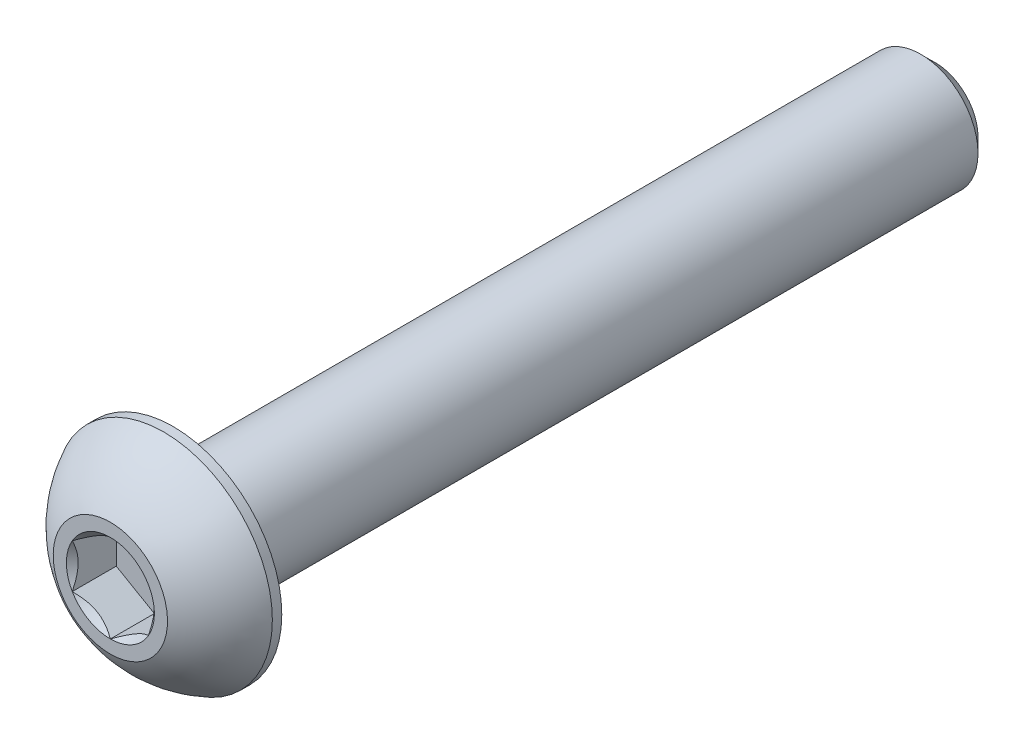
ISO-10303-21;
HEADER;
FILE_DESCRIPTION(('STEP AP214'),'2;1');
FILE_NAME('part.step','',(''),(''),'','','');
FILE_SCHEMA(('AUTOMOTIVE_DESIGN { 1 0 10303 214 1 1 1 1 }'));
ENDSEC;
DATA;
#1=APPLICATION_CONTEXT('core data for automotive mechanical design processes');
#2=APPLICATION_PROTOCOL_DEFINITION('international standard','automotive_design',2000,#1);
#3=PRODUCT_CONTEXT('',#1,'mechanical');
#4=PRODUCT('Part','Part','',(#3));
#5=PRODUCT_RELATED_PRODUCT_CATEGORY('part','',(#4));
#6=PRODUCT_DEFINITION_FORMATION('','',#4);
#7=PRODUCT_DEFINITION_CONTEXT('part definition',#1,'design');
#8=PRODUCT_DEFINITION('design','',#6,#7);
#9=PRODUCT_DEFINITION_SHAPE('','',#8);
#10=(LENGTH_UNIT() NAMED_UNIT(*) SI_UNIT(.MILLI.,.METRE.));
#11=(NAMED_UNIT(*) PLANE_ANGLE_UNIT() SI_UNIT($,.RADIAN.));
#12=(NAMED_UNIT(*) SI_UNIT($,.STERADIAN.) SOLID_ANGLE_UNIT());
#13=UNCERTAINTY_MEASURE_WITH_UNIT(LENGTH_MEASURE(1.E-05),#10,'distance_accuracy_value','');
#14=(GEOMETRIC_REPRESENTATION_CONTEXT(3) GLOBAL_UNCERTAINTY_ASSIGNED_CONTEXT((#13)) GLOBAL_UNIT_ASSIGNED_CONTEXT((#10,
#11,#12)) REPRESENTATION_CONTEXT('',''));
#15=CARTESIAN_POINT('',(0.,0.,0.));
#16=DIRECTION('',(0.,0.,1.));
#17=DIRECTION('',(1.,0.,0.));
#18=AXIS2_PLACEMENT_3D('',#15,#16,#17);
#19=CARTESIAN_POINT('',(0.,-1.5,-21.65));
#20=DIRECTION('',(0.,0.,-1.));
#21=DIRECTION('',(0.,1.,0.));
#22=AXIS2_PLACEMENT_3D('',#19,#20,#21);
#23=PLANE('',#22);
#24=CARTESIAN_POINT('',(0.,0.,-21.65));
#25=DIRECTION('',(0.,0.,-1.));
#26=DIRECTION('',(0.,1.,0.));
#27=AXIS2_PLACEMENT_3D('',#24,#25,#26);
#28=CIRCLE('',#27,1.125);
#29=CARTESIAN_POINT('',(0.,-1.125,-21.65));
#30=VERTEX_POINT('',#29);
#31=EDGE_CURVE('E175',#30,#30,#28,.T.);
#32=ORIENTED_EDGE('',*,*,#31,.T.);
#33=EDGE_LOOP('',(#32));
#34=FACE_BOUND('',#33,.T.);
#35=ADVANCED_FACE('F35',(#34),#23,.T.);
#36=CARTESIAN_POINT('',(0.,0.,-21.65));
#37=DIRECTION('',(0.,0.,-1.));
#38=DIRECTION('',(0.,1.,0.));
#39=AXIS2_PLACEMENT_3D('',#36,#37,#38);
#40=CYLINDRICAL_SURFACE('',#39,1.5);
#41=CARTESIAN_POINT('',(0.,0.,-21.275));
#42=DIRECTION('',(0.,0.,-1.));
#43=DIRECTION('',(0.,1.,0.));
#44=AXIS2_PLACEMENT_3D('',#41,#42,#43);
#45=CIRCLE('',#44,1.5);
#46=CARTESIAN_POINT('',(0.,-1.5,-21.275));
#47=VERTEX_POINT('',#46);
#48=EDGE_CURVE('E49',#47,#47,#45,.F.);
#49=ORIENTED_EDGE('',*,*,#48,.T.);
#50=EDGE_LOOP('',(#49));
#51=FACE_BOUND('',#50,.T.);
#52=CARTESIAN_POINT('',(0.,0.,-1.65));
#53=DIRECTION('',(0.,0.,1.));
#54=DIRECTION('',(1.,0.,0.));
#55=AXIS2_PLACEMENT_3D('',#52,#53,#54);
#56=CIRCLE('',#55,1.5);
#57=CARTESIAN_POINT('',(1.5,0.,-1.65));
#58=VERTEX_POINT('',#57);
#59=EDGE_CURVE('E172',#58,#58,#56,.F.);
#60=ORIENTED_EDGE('',*,*,#59,.T.);
#61=EDGE_LOOP('',(#60));
#62=FACE_BOUND('',#61,.T.);
#63=ADVANCED_FACE('F180',(#51,#62),#40,.T.);
#64=CARTESIAN_POINT('',(0.,0.,-21.65));
#65=DIRECTION('',(0.,0.,1.));
#66=DIRECTION('',(0.,-1.,0.));
#67=AXIS2_PLACEMENT_3D('',#64,#65,#66);
#68=CONICAL_SURFACE('',#67,1.125,0.785398163397446);
#69=CARTESIAN_POINT('',(0.,-1.5,-21.275));
#70=CARTESIAN_POINT('',(0.,-1.49609375,-21.27890625));
#71=CARTESIAN_POINT('',(0.,-1.4921875,-21.2828125));
#72=CARTESIAN_POINT('',(0.,-1.484375,-21.290625));
#73=CARTESIAN_POINT('',(0.,-1.48046875,-21.29453125));
#74=CARTESIAN_POINT('',(0.,-1.47265625,-21.30234375));
#75=CARTESIAN_POINT('',(0.,-1.46875,-21.30625));
#76=CARTESIAN_POINT('',(0.,-1.4609375,-21.3140625));
#77=CARTESIAN_POINT('',(0.,-1.45703125,-21.31796875));
#78=CARTESIAN_POINT('',(0.,-1.44921875,-21.32578125));
#79=CARTESIAN_POINT('',(0.,-1.4453125,-21.3296875));
#80=CARTESIAN_POINT('',(0.,-1.4375,-21.3375));
#81=CARTESIAN_POINT('',(0.,-1.43359375,-21.34140625));
#82=CARTESIAN_POINT('',(0.,-1.42578125,-21.34921875));
#83=CARTESIAN_POINT('',(0.,-1.421875,-21.353125));
#84=CARTESIAN_POINT('',(0.,-1.4140625,-21.3609375));
#85=CARTESIAN_POINT('',(0.,-1.41015625,-21.36484375));
#86=CARTESIAN_POINT('',(0.,-1.40234375,-21.37265625));
#87=CARTESIAN_POINT('',(0.,-1.3984375,-21.3765625));
#88=CARTESIAN_POINT('',(0.,-1.390625,-21.384375));
#89=CARTESIAN_POINT('',(0.,-1.38671875,-21.38828125));
#90=CARTESIAN_POINT('',(0.,-1.37890625,-21.39609375));
#91=CARTESIAN_POINT('',(0.,-1.375,-21.4));
#92=CARTESIAN_POINT('',(0.,-1.3671875,-21.4078125));
#93=CARTESIAN_POINT('',(0.,-1.36328125,-21.41171875));
#94=CARTESIAN_POINT('',(0.,-1.35546875,-21.41953125));
#95=CARTESIAN_POINT('',(0.,-1.3515625,-21.4234375));
#96=CARTESIAN_POINT('',(0.,-1.34375,-21.43125));
#97=CARTESIAN_POINT('',(0.,-1.33984375,-21.43515625));
#98=CARTESIAN_POINT('',(0.,-1.33203125,-21.44296875));
#99=CARTESIAN_POINT('',(0.,-1.328125,-21.446875));
#100=CARTESIAN_POINT('',(0.,-1.3203125,-21.4546875));
#101=CARTESIAN_POINT('',(0.,-1.31640625,-21.45859375));
#102=CARTESIAN_POINT('',(0.,-1.30859375,-21.46640625));
#103=CARTESIAN_POINT('',(0.,-1.3046875,-21.4703125));
#104=CARTESIAN_POINT('',(0.,-1.296875,-21.478125));
#105=CARTESIAN_POINT('',(0.,-1.29296875,-21.48203125));
#106=CARTESIAN_POINT('',(0.,-1.28515625,-21.48984375));
#107=CARTESIAN_POINT('',(0.,-1.28125,-21.49375));
#108=CARTESIAN_POINT('',(0.,-1.2734375,-21.5015625));
#109=CARTESIAN_POINT('',(0.,-1.26953125,-21.50546875));
#110=CARTESIAN_POINT('',(0.,-1.26171875,-21.51328125));
#111=CARTESIAN_POINT('',(0.,-1.2578125,-21.5171875));
#112=CARTESIAN_POINT('',(0.,-1.25,-21.525));
#113=CARTESIAN_POINT('',(0.,-1.24609375,-21.52890625));
#114=CARTESIAN_POINT('',(0.,-1.23828125,-21.53671875));
#115=CARTESIAN_POINT('',(0.,-1.234375,-21.540625));
#116=CARTESIAN_POINT('',(0.,-1.2265625,-21.5484375));
#117=CARTESIAN_POINT('',(0.,-1.22265625,-21.55234375));
#118=CARTESIAN_POINT('',(0.,-1.21484375,-21.56015625));
#119=CARTESIAN_POINT('',(0.,-1.2109375,-21.5640625));
#120=CARTESIAN_POINT('',(0.,-1.203125,-21.571875));
#121=CARTESIAN_POINT('',(0.,-1.19921875,-21.57578125));
#122=CARTESIAN_POINT('',(0.,-1.19140625,-21.58359375));
#123=CARTESIAN_POINT('',(0.,-1.1875,-21.5875));
#124=CARTESIAN_POINT('',(0.,-1.1796875,-21.5953125));
#125=CARTESIAN_POINT('',(0.,-1.17578125,-21.59921875));
#126=CARTESIAN_POINT('',(0.,-1.16796875,-21.60703125));
#127=CARTESIAN_POINT('',(0.,-1.1640625,-21.6109375));
#128=CARTESIAN_POINT('',(0.,-1.15625,-21.61875));
#129=CARTESIAN_POINT('',(0.,-1.15234375,-21.62265625));
#130=CARTESIAN_POINT('',(0.,-1.14453125,-21.63046875));
#131=CARTESIAN_POINT('',(0.,-1.140625,-21.634375));
#132=CARTESIAN_POINT('',(0.,-1.1328125,-21.6421875));
#133=CARTESIAN_POINT('',(0.,-1.12890625,-21.64609375));
#134=CARTESIAN_POINT('',(0.,-1.125,-21.65));
#135=B_SPLINE_CURVE_WITH_KNOTS('',3,(#69,#70,#71,#72,#73,#74,#75,#76,#77,#78,#79,#80,#81,#82,
#83,#84,#85,#86,#87,#88,#89,#90,#91,#92,#93,#94,#95,#96,#97,#98,#99,#100,#101,#102,#103,#104,
#105,#106,#107,#108,#109,#110,#111,#112,#113,#114,#115,#116,#117,#118,#119,#120,#121,#122,#123,
#124,#125,#126,#127,#128,#129,#130,#131,#132,#133,#134),.UNSPECIFIED.,.F.,.F.,(4,2,2,2,2,2,2,2,
2,2,2,2,2,2,2,2,2,2,2,2,2,2,2,2,2,2,2,2,2,2,2,2,4),(0.,0.0165728151840599,0.0331456303681198,
0.0497184455521798,0.0662912607362397,0.0828640759202995,0.0994368911043594,0.116009706288417,
0.132582521472477,0.149155336656537,0.165728151840597,0.182300967024657,0.198873782208716,
0.215446597392774,0.232019412576834,0.248592227760894,0.265165042944954,0.281737858129014,
0.298310673313074,0.314883488497133,0.331456303681191,0.348029118865251,0.364601934049311,
0.381174749233371,0.397747564417431,0.414320379601491,0.430893194785548,0.447466009969608,
0.464038825153668,0.480611640337728,0.497184455521788,0.513757270705848,0.530330085889905),.UNSPECIFIED.);
#136=EDGE_CURVE('BSEAM37',#47,#30,#135,.T.);
#137=ORIENTED_EDGE('',*,*,#48,.F.);
#138=ORIENTED_EDGE('',*,*,#31,.F.);
#139=ORIENTED_EDGE('',*,*,#136,.T.);
#140=ORIENTED_EDGE('',*,*,#136,.F.);
#141=EDGE_LOOP('',(#137,#139,#138,#140));
#142=FACE_BOUND('',#141,.T.);
#143=ADVANCED_FACE('F37',(#142),#68,.T.);
#144=CARTESIAN_POINT('',(0.,0.,-2.79483288770053));
#145=DIRECTION('',(0.,0.,1.));
#146=DIRECTION('',(0.,-1.,0.));
#147=AXIS2_PLACEMENT_3D('',#144,#145,#146);
#148=SPHERICAL_SURFACE('',#147,3.17192226735973);
#149=CARTESIAN_POINT('',(0.,0.,0.));
#150=DIRECTION('',(0.,0.,1.));
#151=DIRECTION('',(1.,0.,0.));
#152=AXIS2_PLACEMENT_3D('',#149,#150,#151);
#153=CIRCLE('',#152,1.5);
#154=CARTESIAN_POINT('',(0.,-1.5,0.));
#155=VERTEX_POINT('',#154);
#156=EDGE_CURVE('E169',#155,#155,#153,.T.);
#157=CARTESIAN_POINT('',(0.,0.,-1.4025));
#158=DIRECTION('',(0.,0.,1.));
#159=DIRECTION('',(1.,0.,0.));
#160=AXIS2_PLACEMENT_3D('',#157,#158,#159);
#161=CIRCLE('',#160,2.85);
#162=CARTESIAN_POINT('',(0.,-2.85,-1.4025));
#163=VERTEX_POINT('',#162);
#164=EDGE_CURVE('E163',#163,#163,#161,.T.);
#165=CARTESIAN_POINT('',(0.,-1.5,0.));
#166=CARTESIAN_POINT('',(0.,-1.5181600798921,-0.00974656947336525));
#167=CARTESIAN_POINT('',(0.,-1.53622513742981,-0.0196701847238475));
#168=CARTESIAN_POINT('',(0.,-1.57215840256594,-0.0398676311293121));
#169=CARTESIAN_POINT('',(0.,-1.59002661016438,-0.0501414622842944));
#170=CARTESIAN_POINT('',(0.,-1.6255593701915,-0.0710354648490241));
#171=CARTESIAN_POINT('',(0.,-1.64322392262019,-0.0816556362587714));
#172=CARTESIAN_POINT('',(0.,-1.67834266450262,-0.103238276426967));
#173=CARTESIAN_POINT('',(0.,-1.69579685395636,-0.114200745185416));
#174=CARTESIAN_POINT('',(0.,-1.73048823664554,-0.136463816635606));
#175=CARTESIAN_POINT('',(0.,-1.74772542988099,-0.147764419327347));
#176=CARTESIAN_POINT('',(0.,-1.78197627078176,-0.170699464187153));
#177=CARTESIAN_POINT('',(0.,-1.79898991844709,-0.182333906355219));
#178=CARTESIAN_POINT('',(0.,-1.83278720341135,-0.205932209546912));
#179=CARTESIAN_POINT('',(0.,-1.84957084071028,-0.21789607057054));
#180=CARTESIAN_POINT('',(0.,-1.88290172764636,-0.242148665498754));
#181=CARTESIAN_POINT('',(0.,-1.8994489772835,-0.254437399403341));
#182=CARTESIAN_POINT('',(0.,-1.93230080139369,-0.279335070725423));
#183=CARTESIAN_POINT('',(0.,-1.94860537586673,-0.291944008142919));
#184=CARTESIAN_POINT('',(0.,-1.98096565436365,-0.317477295441111));
#185=CARTESIAN_POINT('',(0.,-1.99702135838753,-0.330401645321806));
#186=CARTESIAN_POINT('',(0.,-2.02887779526296,-0.356560846652225));
#187=CARTESIAN_POINT('',(0.,-2.04467852811452,-0.369795698101948));
#188=CARTESIAN_POINT('',(0.,-2.07601901880464,-0.396570873693307));
#189=CARTESIAN_POINT('',(0.,-2.09155877664321,-0.410111197834943));
#190=CARTESIAN_POINT('',(0.,-2.12237141262985,-0.437492173862105));
#191=CARTESIAN_POINT('',(0.,-2.13764429077792,-0.451332825747633));
#192=CARTESIAN_POINT('',(0.,-2.16791736411296,-0.479309198198267));
#193=CARTESIAN_POINT('',(0.,-2.18291755929993,-0.493444918763374));
#194=CARTESIAN_POINT('',(0.,-2.21263956705415,-0.52200605739095));
#195=CARTESIAN_POINT('',(0.,-2.22736137962139,-0.536431475453418));
#196=CARTESIAN_POINT('',(0.,-2.2565210282552,-0.56556652781647));
#197=CARTESIAN_POINT('',(0.,-2.27095886432177,-0.580276162117054));
#198=CARTESIAN_POINT('',(0.,-2.2995450739765,-0.609974057702794));
#199=CARTESIAN_POINT('',(0.,-2.31369344756465,-0.624962318987951));
#200=CARTESIAN_POINT('',(0.,-2.34169535627252,-0.655211773418758));
#201=CARTESIAN_POINT('',(0.,-2.35554889139223,-0.670472966564409));
#202=CARTESIAN_POINT('',(0.,-2.38295585920366,-0.701262485885582));
#203=CARTESIAN_POINT('',(0.,-2.39650929189537,-0.716790812061104));
#204=CARTESIAN_POINT('',(0.,-2.42331090492182,-0.748108697108241));
#205=CARTESIAN_POINT('',(0.,-2.43655908525656,-0.763898255979857));
#206=CARTESIAN_POINT('',(0.,-2.46274515962755,-0.795732606824226));
#207=CARTESIAN_POINT('',(0.,-2.47568305366379,-0.811777398796979));
#208=CARTESIAN_POINT('',(0.,-2.50124363939651,-0.844116119267125));
#209=CARTESIAN_POINT('',(0.,-2.51386633109298,-0.860410047764518));
#210=CARTESIAN_POINT('',(0.,-2.53879171587278,-0.893240850042598));
#211=CARTESIAN_POINT('',(0.,-2.55109440895612,-0.909777723823285));
#212=CARTESIAN_POINT('',(0.,-2.57537512182785,-0.943088133113638));
#213=CARTESIAN_POINT('',(0.,-2.58735314161625,-0.959861668623304));
#214=CARTESIAN_POINT('',(0.,-2.61097995657956,-0.993639027894246));
#215=CARTESIAN_POINT('',(0.,-2.62262875175448,-1.01064285165552));
#216=CARTESIAN_POINT('',(0.,-2.64559269128199,-1.04487432644225));
#217=CARTESIAN_POINT('',(0.,-2.65690783563458,-1.06210197746771));
#218=CARTESIAN_POINT('',(0.,-2.67920017403639,-1.09677456077299));
#219=CARTESIAN_POINT('',(0.,-2.69017736808561,-1.11421949305282));
#220=CARTESIAN_POINT('',(0.,-2.711789634999,-1.14932001019995));
#221=CARTESIAN_POINT('',(0.,-2.72242470786316,-1.16697559506725));
#222=CARTESIAN_POINT('',(0.,-2.74334869082118,-1.20249070903943));
#223=CARTESIAN_POINT('',(0.,-2.75363760091502,-1.22035023814429));
#224=CARTESIAN_POINT('',(0.,-2.77386535089241,-1.25626645340824));
#225=CARTESIAN_POINT('',(0.,-2.78380419077596,-1.27432313956732));
#226=CARTESIAN_POINT('',(0.,-2.80332801615778,-1.31062681184411));
#227=CARTESIAN_POINT('',(0.,-2.81291300165605,-1.32887379796182));
#228=CARTESIAN_POINT('',(0.,-2.83172550494215,-1.3655511220839));
#229=CARTESIAN_POINT('',(0.,-2.84095302272998,-1.38398146008827));
#230=CARTESIAN_POINT('',(0.,-2.85,-1.4025));
#231=B_SPLINE_CURVE_WITH_KNOTS('',3,(#165,#166,#167,#168,#169,#170,#171,#172,#173,#174,#175,
#176,#177,#178,#179,#180,#181,#182,#183,#184,#185,#186,#187,#188,#189,#190,#191,#192,#193,#194,
#195,#196,#197,#198,#199,#200,#201,#202,#203,#204,#205,#206,#207,#208,#209,#210,#211,#212,#213,
#214,#215,#216,#217,#218,#219,#220,#221,#222,#223,#224,#225,#226,#227,#228,#229,#230),
.UNSPECIFIED.,.F.,.F.,(4,2,2,2,2,2,2,2,2,2,2,2,2,2,2,2,2,2,2,2,2,2,2,2,2,2,2,2,2,2,2,2,4),(0.,
0.0618298941826981,0.123659788365397,0.185489682548095,0.247319576730793,0.309149470913491,
0.37097936509619,0.432809259278888,0.494639153461585,0.556469047644284,0.618298941826982,
0.680128836009681,0.741958730192379,0.803788624375077,0.865618518557775,0.927448412740473,
0.989278306923172,1.05110820110587,1.11293809528857,1.17476798947127,1.23659788365396,
1.29842777783666,1.36025767201936,1.42208756620206,1.48391746038476,1.54574735456746,
1.60757724875015,1.66940714293285,1.73123703711555,1.79306693129825,1.85489682548095,
1.91672671966364,1.97855661384634),.UNSPECIFIED.);
#232=EDGE_CURVE('BSEAM185',#155,#163,#231,.T.);
#233=ORIENTED_EDGE('',*,*,#156,.F.);
#234=ORIENTED_EDGE('',*,*,#164,.T.);
#235=ORIENTED_EDGE('',*,*,#232,.T.);
#236=ORIENTED_EDGE('',*,*,#232,.F.);
#237=EDGE_LOOP('',(#233,#235,#234,#236));
#238=FACE_BOUND('',#237,.T.);
#239=ADVANCED_FACE('F185',(#238),#148,.T.);
#240=CARTESIAN_POINT('',(0.,-1.5,0.));
#241=DIRECTION('',(0.,0.,-1.));
#242=DIRECTION('',(-1.,0.,0.));
#243=AXIS2_PLACEMENT_3D('',#240,#241,#242);
#244=PLANE('',#243);
#245=CARTESIAN_POINT('',(0.,0.,0.));
#246=DIRECTION('',(0.,0.,1.));
#247=DIRECTION('',(1.,0.,0.));
#248=AXIS2_PLACEMENT_3D('',#245,#246,#247);
#249=CIRCLE('',#248,1.15470053837925);
#250=CARTESIAN_POINT('',(-1.,0.577350269189626,0.));
#251=VERTEX_POINT('',#250);
#252=CARTESIAN_POINT('',(-1.,-0.577350269189626,0.));
#253=VERTEX_POINT('',#252);
#254=EDGE_CURVE('E62',#251,#253,#249,.T.);
#255=ORIENTED_EDGE('',*,*,#254,.F.);
#256=CARTESIAN_POINT('',(0.,1.15470053837925,0.));
#257=VERTEX_POINT('',#256);
#258=EDGE_CURVE('E134',#257,#251,#249,.T.);
#259=ORIENTED_EDGE('',*,*,#258,.F.);
#260=CARTESIAN_POINT('',(1.,0.577350269189626,0.));
#261=VERTEX_POINT('',#260);
#262=EDGE_CURVE('E131',#261,#257,#249,.T.);
#263=ORIENTED_EDGE('',*,*,#262,.F.);
#264=CARTESIAN_POINT('',(1.,-0.577350269189626,0.));
#265=VERTEX_POINT('',#264);
#266=EDGE_CURVE('E102',#265,#261,#249,.T.);
#267=ORIENTED_EDGE('',*,*,#266,.F.);
#268=CARTESIAN_POINT('',(0.,-1.15470053837925,0.));
#269=VERTEX_POINT('',#268);
#270=EDGE_CURVE('E94',#269,#265,#249,.T.);
#271=ORIENTED_EDGE('',*,*,#270,.F.);
#272=EDGE_CURVE('E55',#253,#269,#249,.T.);
#273=ORIENTED_EDGE('',*,*,#272,.F.);
#274=EDGE_LOOP('',(#255,#259,#263,#267,#271,#273));
#275=FACE_BOUND('',#274,.T.);
#276=ORIENTED_EDGE('',*,*,#156,.T.);
#277=EDGE_LOOP('',(#276));
#278=FACE_BOUND('',#277,.T.);
#279=ADVANCED_FACE('F128',(#275,#278),#244,.F.);
#280=CARTESIAN_POINT('',(0.,-2.85,-1.65));
#281=DIRECTION('',(0.,0.,1.));
#282=DIRECTION('',(1.,0.,0.));
#283=AXIS2_PLACEMENT_3D('',#280,#281,#282);
#284=PLANE('',#283);
#285=ORIENTED_EDGE('',*,*,#59,.F.);
#286=EDGE_LOOP('',(#285));
#287=FACE_BOUND('',#286,.T.);
#288=CARTESIAN_POINT('',(0.,0.,-1.65));
#289=DIRECTION('',(0.,0.,1.));
#290=DIRECTION('',(1.,0.,0.));
#291=AXIS2_PLACEMENT_3D('',#288,#289,#290);
#292=CIRCLE('',#291,2.85);
#293=CARTESIAN_POINT('',(2.85,0.,-1.65));
#294=VERTEX_POINT('',#293);
#295=EDGE_CURVE('E166',#294,#294,#292,.T.);
#296=ORIENTED_EDGE('',*,*,#295,.F.);
#297=EDGE_LOOP('',(#296));
#298=FACE_BOUND('',#297,.T.);
#299=ADVANCED_FACE('F199',(#287,#298),#284,.F.);
#300=CARTESIAN_POINT('',(0.,0.,0.));
#301=DIRECTION('',(0.,0.,1.));
#302=DIRECTION('',(1.,0.,0.));
#303=AXIS2_PLACEMENT_3D('',#300,#301,#302);
#304=CYLINDRICAL_SURFACE('',#303,2.85);
#305=ORIENTED_EDGE('',*,*,#164,.F.);
#306=EDGE_LOOP('',(#305));
#307=FACE_BOUND('',#306,.T.);
#308=ORIENTED_EDGE('',*,*,#295,.T.);
#309=EDGE_LOOP('',(#308));
#310=FACE_BOUND('',#309,.T.);
#311=ADVANCED_FACE('F202',(#307,#310),#304,.T.);
#312=CARTESIAN_POINT('',(0.,0.,0.));
#313=DIRECTION('',(0.,0.,1.));
#314=DIRECTION('',(1.,0.,0.));
#315=AXIS2_PLACEMENT_3D('',#312,#313,#314);
#316=CONICAL_SURFACE('',#315,1.15470053837925,0.78539816339745);
#317=ORIENTED_EDGE('',*,*,#266,.T.);
#318=CARTESIAN_POINT('',(1.,-1.15147208646462,0.370385677513861));
#319=CARTESIAN_POINT('',(1.,-1.12343447988552,0.349219919873711));
#320=CARTESIAN_POINT('',(1.,-1.09524064850697,0.328261692175909));
#321=CARTESIAN_POINT('',(1.,-1.03847715644376,0.286846022235621));
#322=CARTESIAN_POINT('',(1.,-1.00990740382975,0.266388706123658));
#323=CARTESIAN_POINT('',(1.,-0.923120894333476,0.205604794954508));
#324=CARTESIAN_POINT('',(1.,-0.864253173759059,0.166192228961397));
#325=CARTESIAN_POINT('',(1.,-0.740809858258045,0.0888206642002044));
#326=CARTESIAN_POINT('',(1.,-0.676100255137807,0.0510730391143415));
#327=CARTESIAN_POINT('',(1.,-0.543448939049124,-0.0179754124487089));
#328=CARTESIAN_POINT('',(1.,-0.475519112027778,-0.0492979721531352));
#329=CARTESIAN_POINT('',(1.,-0.373555850333528,-0.0876182211162057));
#330=CARTESIAN_POINT('',(1.,-0.341031989670907,-0.0986164083578442));
#331=CARTESIAN_POINT('',(1.,-0.275199079052293,-0.11800165785264));
#332=CARTESIAN_POINT('',(1.,-0.241889975173933,-0.126388540223301));
#333=CARTESIAN_POINT('',(1.,-0.175247517042992,-0.139974779280984));
#334=CARTESIAN_POINT('',(1.,-0.141925568218175,-0.145229209232033));
#335=CARTESIAN_POINT('',(1.,-0.0749144362322788,-0.152451313429108));
#336=CARTESIAN_POINT('',(1.,-0.0412251978501616,-0.154418486389493));
#337=CARTESIAN_POINT('',(1.,0.0249580992634212,-0.15491680160684));
#338=CARTESIAN_POINT('',(1.,0.0574512826460396,-0.153569732111366));
#339=CARTESIAN_POINT('',(1.,0.122148505701867,-0.147783515501016));
#340=CARTESIAN_POINT('',(1.,0.154352610132927,-0.143345079338465));
#341=CARTESIAN_POINT('',(1.,0.21879989886764,-0.131543169854797));
#342=CARTESIAN_POINT('',(1.,0.251033743268954,-0.124129458961491));
#343=CARTESIAN_POINT('',(1.,0.314797132354919,-0.106771057501325));
#344=CARTESIAN_POINT('',(1.,0.346326735731005,-0.0968265787111708));
#345=CARTESIAN_POINT('',(1.,0.445594187730205,-0.0617765174456637));
#346=CARTESIAN_POINT('',(1.,0.511919139476036,-0.0326791416432759));
#347=CARTESIAN_POINT('',(1.,0.641453244657532,0.0320153296865042));
#348=CARTESIAN_POINT('',(1.,0.704650133126344,0.0676357767152411));
#349=CARTESIAN_POINT('',(1.,0.825428490174987,0.141123901346935));
#350=CARTESIAN_POINT('',(1.,0.883132947867685,0.178791947135463));
#351=CARTESIAN_POINT('',(1.,0.968148853704565,0.237022852943162));
#352=CARTESIAN_POINT('',(1.,0.996120570380285,0.256638475762856));
#353=CARTESIAN_POINT('',(1.,1.05168177729901,0.29638851706127));
#354=CARTESIAN_POINT('',(1.,1.079271369977,0.316522792198831));
#355=CARTESIAN_POINT('',(1.,1.10670185346329,0.336872119072971));
#356=B_SPLINE_CURVE_WITH_KNOTS('',3,(#318,#319,#320,#321,#322,#323,#324,#325,#326,#327,#328,
#329,#330,#331,#332,#333,#334,#335,#336,#337,#338,#339,#340,#341,#342,#343,#344,#345,#346,#347,
#348,#349,#350,#351,#352,#353,#354,#355),.UNSPECIFIED.,.F.,.F.,(4,2,2,2,2,2,2,2,2,2,2,2,2,2,2,2,
2,2,4),(0.,0.105386459083291,0.210799187330124,0.423233611565469,0.647793540908503,
0.871580877738609,0.97449307418142,1.07741235827201,1.17846428203205,1.27953161415762,
1.3769408673961,1.47432772585408,1.57343322804293,1.67253043972851,1.88917353996827,
2.10660791038813,2.31323734249843,2.41572589232044,2.51818641476503),.UNSPECIFIED.);
#357=EDGE_CURVE('E11',#265,#261,#356,.T.);
#358=ORIENTED_EDGE('',*,*,#357,.F.);
#359=EDGE_LOOP('',(#317,#358));
#360=FACE_BOUND('',#359,.T.);
#361=ADVANCED_FACE('F106',(#360),#316,.F.);
#362=ORIENTED_EDGE('',*,*,#262,.T.);
#363=CARTESIAN_POINT('',(1.0002,0.577234799135788,0.000115487372614006));
#364=CARTESIAN_POINT('',(0.965817404992819,0.597085599618622,-0.0197220691742671));
#365=CARTESIAN_POINT('',(0.930859881860175,0.617268335009456,-0.0383949793611112));
#366=CARTESIAN_POINT('',(0.85957719704391,0.658423412276686,-0.0725852572768422));
#367=CARTESIAN_POINT('',(0.823245249471016,0.67939967198808,-0.0880835909765416));
#368=CARTESIAN_POINT('',(0.749983386196689,0.721697428470846,-0.114632692857735));
#369=CARTESIAN_POINT('',(0.713072148554586,0.743008141459637,-0.125750226003074));
#370=CARTESIAN_POINT('',(0.638437270689141,0.786098608286186,-0.142880134223818));
#371=CARTESIAN_POINT('',(0.600715911891364,0.807877044942281,-0.148905302533327));
#372=CARTESIAN_POINT('',(0.535707801582066,0.845409494928863,-0.154339445032506));
#373=CARTESIAN_POINT('',(0.508505628471828,0.861114676896602,-0.155143061683268));
#374=CARTESIAN_POINT('',(0.454153959330888,0.892494627706029,-0.153793300583113));
#375=CARTESIAN_POINT('',(0.427004476245124,0.908169389073954,-0.151639270452801));
#376=CARTESIAN_POINT('',(0.345943722673039,0.954969836969511,-0.140883027871529));
#377=CARTESIAN_POINT('',(0.292435859021572,0.985862616452447,-0.127985443584644));
#378=CARTESIAN_POINT('',(0.198523934856568,1.04008269114923,-0.0968592693978229));
#379=CARTESIAN_POINT('',(0.157679476328165,1.06366425027551,-0.0802622022981608));
#380=CARTESIAN_POINT('',(0.077590362618056,1.1099037216352,-0.0428750753147072));
#381=CARTESIAN_POINT('',(0.038340989129562,1.1325643579843,-0.0220986581825966));
#382=CARTESIAN_POINT('',(-0.000200000000000344,1.15481600843309,0.000115487372613974));
#383=B_SPLINE_CURVE_WITH_KNOTS('',3,(#363,#364,#365,#366,#367,#368,#369,#370,#371,#372,#373,
#374,#375,#376,#377,#378,#379,#380,#381,#382),.UNSPECIFIED.,.F.,.F.,(4,2,2,2,2,2,2,2,2,4),(0.,
0.133237676828559,0.26725222983449,0.3991370762693,0.530689603280769,0.624814864263847,
0.718960890149133,0.907306626112098,1.05710100361789,1.20641411519286),.UNSPECIFIED.);
#384=EDGE_CURVE('E133',#261,#257,#383,.T.);
#385=ORIENTED_EDGE('',*,*,#384,.F.);
#386=EDGE_LOOP('',(#362,#385));
#387=FACE_BOUND('',#386,.T.);
#388=ADVANCED_FACE('F287',(#387),#316,.F.);
#389=ORIENTED_EDGE('',*,*,#258,.T.);
#390=CARTESIAN_POINT('',(0.000199999999999536,1.15481600843309,0.000115487372613877));
#391=CARTESIAN_POINT('',(-0.0341825950071811,1.13496520795026,-0.0197220691742669));
#392=CARTESIAN_POINT('',(-0.0691401181398252,1.11478247255942,-0.038394979361111));
#393=CARTESIAN_POINT('',(-0.14042280295609,1.07362739529219,-0.0725852572768421));
#394=CARTESIAN_POINT('',(-0.176754750528984,1.0526511355808,-0.0880835909765415));
#395=CARTESIAN_POINT('',(-0.250016613803311,1.01035337909803,-0.114632692857735));
#396=CARTESIAN_POINT('',(-0.286927851445415,0.989042666109241,-0.125750226003074));
#397=CARTESIAN_POINT('',(-0.36156272931086,0.945952199282691,-0.142880134223818));
#398=CARTESIAN_POINT('',(-0.399284088108636,0.924173762626596,-0.148905302533327));
#399=CARTESIAN_POINT('',(-0.464292198417934,0.886641312640014,-0.154339445032506));
#400=CARTESIAN_POINT('',(-0.491494371528173,0.870936130672275,-0.155143061683268));
#401=CARTESIAN_POINT('',(-0.545846040669112,0.839556179862848,-0.153793300583113));
#402=CARTESIAN_POINT('',(-0.572995523754876,0.823881418494923,-0.151639270452801));
#403=CARTESIAN_POINT('',(-0.654056277326961,0.777080970599366,-0.140883027871529));
#404=CARTESIAN_POINT('',(-0.707564140978428,0.74618819111643,-0.127985443584644));
#405=CARTESIAN_POINT('',(-0.801476065143432,0.691968116419649,-0.0968592693978229));
#406=CARTESIAN_POINT('',(-0.842320523671834,0.668386557293371,-0.0802622022981608));
#407=CARTESIAN_POINT('',(-0.922409637381944,0.622147085933681,-0.0428750753147074));
#408=CARTESIAN_POINT('',(-0.961659010870438,0.599486449584575,-0.0220986581825969));
#409=CARTESIAN_POINT('',(-1.0002,0.577234799135788,0.000115487372613628));
#410=B_SPLINE_CURVE_WITH_KNOTS('',3,(#390,#391,#392,#393,#394,#395,#396,#397,#398,#399,#400,
#401,#402,#403,#404,#405,#406,#407,#408,#409),.UNSPECIFIED.,.F.,.F.,(4,2,2,2,2,2,2,2,2,4),(0.,
0.133237676828559,0.26725222983449,0.3991370762693,0.530689603280768,0.624814864263846,
0.718960890149133,0.907306626112098,1.05710100361789,1.20641411519286),.UNSPECIFIED.);
#411=EDGE_CURVE('E138',#257,#251,#410,.T.);
#412=ORIENTED_EDGE('',*,*,#411,.F.);
#413=EDGE_LOOP('',(#389,#412));
#414=FACE_BOUND('',#413,.T.);
#415=ADVANCED_FACE('F141',(#414),#316,.F.);
#416=ORIENTED_EDGE('',*,*,#254,.T.);
#417=CARTESIAN_POINT('',(-1.,-1.15147208646462,0.370385677513861));
#418=CARTESIAN_POINT('',(-1.,-1.12343447988552,0.349219919873711));
#419=CARTESIAN_POINT('',(-1.,-1.09524064850697,0.328261692175909));
#420=CARTESIAN_POINT('',(-1.,-1.03847715644376,0.286846022235621));
#421=CARTESIAN_POINT('',(-1.,-1.00990740382975,0.266388706123658));
#422=CARTESIAN_POINT('',(-1.,-0.923120894333476,0.205604794954509));
#423=CARTESIAN_POINT('',(-1.,-0.864253173759059,0.166192228961397));
#424=CARTESIAN_POINT('',(-1.,-0.740809858258045,0.0888206642002043));
#425=CARTESIAN_POINT('',(-1.,-0.676100255137807,0.0510730391143417));
#426=CARTESIAN_POINT('',(-1.,-0.543448939049124,-0.0179754124487087));
#427=CARTESIAN_POINT('',(-1.,-0.475519112027779,-0.0492979721531351));
#428=CARTESIAN_POINT('',(-1.,-0.373555850333529,-0.0876182211162056));
#429=CARTESIAN_POINT('',(-1.,-0.341031989670908,-0.0986164083578442));
#430=CARTESIAN_POINT('',(-1.,-0.275199079052293,-0.11800165785264));
#431=CARTESIAN_POINT('',(-1.,-0.241889975173933,-0.126388540223301));
#432=CARTESIAN_POINT('',(-1.,-0.175247517042993,-0.139974779280984));
#433=CARTESIAN_POINT('',(-1.,-0.141925568218175,-0.145229209232033));
#434=CARTESIAN_POINT('',(-1.,-0.0749144362322789,-0.152451313429108));
#435=CARTESIAN_POINT('',(-1.,-0.0412251978501616,-0.154418486389493));
#436=CARTESIAN_POINT('',(-1.,0.0249580992634211,-0.15491680160684));
#437=CARTESIAN_POINT('',(-1.,0.0574512826460394,-0.153569732111366));
#438=CARTESIAN_POINT('',(-1.,0.122148505701867,-0.147783515501016));
#439=CARTESIAN_POINT('',(-1.,0.154352610132926,-0.143345079338465));
#440=CARTESIAN_POINT('',(-1.,0.21879989886764,-0.131543169854797));
#441=CARTESIAN_POINT('',(-1.,0.251033743268954,-0.124129458961491));
#442=CARTESIAN_POINT('',(-1.,0.314797132354919,-0.106771057501325));
#443=CARTESIAN_POINT('',(-1.,0.346326735731004,-0.0968265787111709));
#444=CARTESIAN_POINT('',(-1.,0.445594187730205,-0.0617765174456641));
#445=CARTESIAN_POINT('',(-1.,0.511919139476036,-0.0326791416432763));
#446=CARTESIAN_POINT('',(-1.,0.641453244657532,0.0320153296865039));
#447=CARTESIAN_POINT('',(-1.,0.704650133126344,0.0676357767152408));
#448=CARTESIAN_POINT('',(-1.,0.825428490174986,0.141123901346934));
#449=CARTESIAN_POINT('',(-1.,0.883132947867684,0.178791947135462));
#450=CARTESIAN_POINT('',(-1.,0.968148853704565,0.237022852943162));
#451=CARTESIAN_POINT('',(-1.,0.996120570380285,0.256638475762855));
#452=CARTESIAN_POINT('',(-1.,1.05168177729901,0.29638851706127));
#453=CARTESIAN_POINT('',(-1.,1.079271369977,0.316522792198831));
#454=CARTESIAN_POINT('',(-1.,1.10670185346329,0.336872119072971));
#455=B_SPLINE_CURVE_WITH_KNOTS('',3,(#417,#418,#419,#420,#421,#422,#423,#424,#425,#426,#427,
#428,#429,#430,#431,#432,#433,#434,#435,#436,#437,#438,#439,#440,#441,#442,#443,#444,#445,#446,
#447,#448,#449,#450,#451,#452,#453,#454),.UNSPECIFIED.,.F.,.F.,(4,2,2,2,2,2,2,2,2,2,2,2,2,2,2,2,
2,2,4),(0.,0.105386459083291,0.210799187330125,0.423233611565469,0.647793540908503,
0.871580877738609,0.97449307418142,1.07741235827201,1.17846428203205,1.27953161415762,
1.3769408673961,1.47432772585408,1.57343322804293,1.67253043972851,1.88917353996827,
2.10660791038813,2.31323734249843,2.41572589232044,2.51818641476503),.UNSPECIFIED.);
#456=EDGE_CURVE('E145',#251,#253,#455,.F.);
#457=ORIENTED_EDGE('',*,*,#456,.F.);
#458=EDGE_LOOP('',(#416,#457));
#459=FACE_BOUND('',#458,.T.);
#460=ADVANCED_FACE('F281',(#459),#316,.F.);
#461=ORIENTED_EDGE('',*,*,#272,.T.);
#462=CARTESIAN_POINT('',(-1.0002,-0.577234799135788,0.000115487372614006));
#463=CARTESIAN_POINT('',(-0.965817404992819,-0.597085599618622,-0.0197220691742672));
#464=CARTESIAN_POINT('',(-0.930859881860175,-0.617268335009456,-0.0383949793611114));
#465=CARTESIAN_POINT('',(-0.85957719704391,-0.658423412276686,-0.0725852572768424));
#466=CARTESIAN_POINT('',(-0.823245249471016,-0.67939967198808,-0.0880835909765416));
#467=CARTESIAN_POINT('',(-0.749983386196688,-0.721697428470846,-0.114632692857735));
#468=CARTESIAN_POINT('',(-0.713072148554585,-0.743008141459637,-0.125750226003074));
#469=CARTESIAN_POINT('',(-0.638437270689141,-0.786098608286186,-0.142880134223818));
#470=CARTESIAN_POINT('',(-0.600715911891364,-0.807877044942281,-0.148905302533328));
#471=CARTESIAN_POINT('',(-0.535707801582066,-0.845409494928863,-0.154339445032506));
#472=CARTESIAN_POINT('',(-0.508505628471828,-0.861114676896602,-0.155143061683268));
#473=CARTESIAN_POINT('',(-0.454153959330888,-0.892494627706029,-0.153793300583113));
#474=CARTESIAN_POINT('',(-0.427004476245124,-0.908169389073954,-0.151639270452801));
#475=CARTESIAN_POINT('',(-0.34594372267304,-0.954969836969511,-0.140883027871529));
#476=CARTESIAN_POINT('',(-0.292435859021572,-0.985862616452447,-0.127985443584644));
#477=CARTESIAN_POINT('',(-0.198523934856568,-1.04008269114923,-0.0968592693978226));
#478=CARTESIAN_POINT('',(-0.157679476328165,-1.06366425027551,-0.0802622022981605));
#479=CARTESIAN_POINT('',(-0.0775903626180561,-1.1099037216352,-0.0428750753147072));
#480=CARTESIAN_POINT('',(-0.0383409891295621,-1.1325643579843,-0.0220986581825966));
#481=CARTESIAN_POINT('',(0.000200000000000129,-1.15481600843309,0.000115487372614058));
#482=B_SPLINE_CURVE_WITH_KNOTS('',3,(#462,#463,#464,#465,#466,#467,#468,#469,#470,#471,#472,
#473,#474,#475,#476,#477,#478,#479,#480,#481),.UNSPECIFIED.,.F.,.F.,(4,2,2,2,2,2,2,2,2,4),(0.,
0.133237676828559,0.267252229834491,0.399137076269301,0.530689603280769,0.624814864263846,
0.718960890149133,0.907306626112098,1.05710100361789,1.20641411519286),.UNSPECIFIED.);
#483=EDGE_CURVE('E118',#253,#269,#482,.T.);
#484=ORIENTED_EDGE('',*,*,#483,.F.);
#485=EDGE_LOOP('',(#461,#484));
#486=FACE_BOUND('',#485,.T.);
#487=ADVANCED_FACE('F229',(#486),#316,.F.);
#488=ORIENTED_EDGE('',*,*,#270,.T.);
#489=CARTESIAN_POINT('',(-0.000199999999999763,-1.15481600843309,0.000115487372614094));
#490=CARTESIAN_POINT('',(0.0341825950071808,-1.13496520795026,-0.0197220691742669));
#491=CARTESIAN_POINT('',(0.069140118139825,-1.11478247255942,-0.0383949793611111));
#492=CARTESIAN_POINT('',(0.14042280295609,-1.07362739529219,-0.072585257276842));
#493=CARTESIAN_POINT('',(0.176754750528984,-1.0526511355808,-0.0880835909765413));
#494=CARTESIAN_POINT('',(0.250016613803311,-1.01035337909803,-0.114632692857735));
#495=CARTESIAN_POINT('',(0.286927851445414,-0.989042666109241,-0.125750226003074));
#496=CARTESIAN_POINT('',(0.361562729310859,-0.945952199282691,-0.142880134223818));
#497=CARTESIAN_POINT('',(0.399284088108636,-0.924173762626596,-0.148905302533327));
#498=CARTESIAN_POINT('',(0.464292198417934,-0.886641312640015,-0.154339445032506));
#499=CARTESIAN_POINT('',(0.491494371528172,-0.870936130672276,-0.155143061683268));
#500=CARTESIAN_POINT('',(0.545846040669112,-0.839556179862848,-0.153793300583113));
#501=CARTESIAN_POINT('',(0.572995523754876,-0.823881418494924,-0.151639270452801));
#502=CARTESIAN_POINT('',(0.65405627732696,-0.777080970599367,-0.140883027871529));
#503=CARTESIAN_POINT('',(0.707564140978427,-0.74618819111643,-0.127985443584644));
#504=CARTESIAN_POINT('',(0.801476065143431,-0.691968116419649,-0.0968592693978229));
#505=CARTESIAN_POINT('',(0.842320523671834,-0.668386557293371,-0.0802622022981608));
#506=CARTESIAN_POINT('',(0.922409637381944,-0.622147085933681,-0.0428750753147075));
#507=CARTESIAN_POINT('',(0.961659010870438,-0.599486449584575,-0.022098658182597));
#508=CARTESIAN_POINT('',(1.0002,-0.577234799135788,0.000115487372613757));
#509=B_SPLINE_CURVE_WITH_KNOTS('',3,(#489,#490,#491,#492,#493,#494,#495,#496,#497,#498,#499,
#500,#501,#502,#503,#504,#505,#506,#507,#508),.UNSPECIFIED.,.F.,.F.,(4,2,2,2,2,2,2,2,2,4),(0.,
0.133237676828559,0.26725222983449,0.3991370762693,0.530689603280768,0.624814864263846,
0.718960890149133,0.907306626112097,1.05710100361789,1.20641411519286),.UNSPECIFIED.);
#510=EDGE_CURVE('E98',#269,#265,#509,.T.);
#511=ORIENTED_EDGE('',*,*,#510,.F.);
#512=EDGE_LOOP('',(#488,#511));
#513=FACE_BOUND('',#512,.T.);
#514=ADVANCED_FACE('F96',(#513),#316,.F.);
#515=CARTESIAN_POINT('',(1.,-0.577350269189625,-1.155));
#516=DIRECTION('',(0.,0.,1.));
#517=DIRECTION('',(1.,0.,0.));
#518=AXIS2_PLACEMENT_3D('',#515,#516,#517);
#519=PLANE('',#518);
#520=DIRECTION('',(0.866025403784438,0.5,0.));
#521=VECTOR('',#520,1.);
#522=CARTESIAN_POINT('',(0.,-1.15470053837925,-1.155));
#523=LINE('',#522,#521);
#524=CARTESIAN_POINT('',(0.,-1.15470053837925,-1.155));
#525=VERTEX_POINT('',#524);
#526=CARTESIAN_POINT('',(1.,-0.577350269189626,-1.155));
#527=VERTEX_POINT('',#526);
#528=EDGE_CURVE('E117',#525,#527,#523,.T.);
#529=ORIENTED_EDGE('',*,*,#528,.T.);
#530=DIRECTION('',(0.,1.,0.));
#531=VECTOR('',#530,1.);
#532=CARTESIAN_POINT('',(1.,-0.577350269189626,-1.155));
#533=LINE('',#532,#531);
#534=CARTESIAN_POINT('',(1.,0.577350269189626,-1.155));
#535=VERTEX_POINT('',#534);
#536=EDGE_CURVE('E122',#527,#535,#533,.T.);
#537=ORIENTED_EDGE('',*,*,#536,.T.);
#538=DIRECTION('',(-0.866025403784439,0.5,0.));
#539=VECTOR('',#538,1.);
#540=CARTESIAN_POINT('',(1.,0.577350269189626,-1.155));
#541=LINE('',#540,#539);
#542=CARTESIAN_POINT('',(0.,1.15470053837925,-1.155));
#543=VERTEX_POINT('',#542);
#544=EDGE_CURVE('E271',#535,#543,#541,.T.);
#545=ORIENTED_EDGE('',*,*,#544,.T.);
#546=DIRECTION('',(-0.866025403784438,-0.5,0.));
#547=VECTOR('',#546,1.);
#548=CARTESIAN_POINT('',(0.,1.15470053837925,-1.155));
#549=LINE('',#548,#547);
#550=CARTESIAN_POINT('',(-1.,0.577350269189626,-1.155));
#551=VERTEX_POINT('',#550);
#552=EDGE_CURVE('E154',#543,#551,#549,.T.);
#553=ORIENTED_EDGE('',*,*,#552,.T.);
#554=DIRECTION('',(0.,-1.,0.));
#555=VECTOR('',#554,1.);
#556=CARTESIAN_POINT('',(-1.,0.577350269189626,-1.155));
#557=LINE('',#556,#555);
#558=CARTESIAN_POINT('',(-1.,-0.577350269189626,-1.155));
#559=VERTEX_POINT('',#558);
#560=EDGE_CURVE('E275',#551,#559,#557,.T.);
#561=ORIENTED_EDGE('',*,*,#560,.T.);
#562=DIRECTION('',(0.866025403784439,-0.5,0.));
#563=VECTOR('',#562,1.);
#564=CARTESIAN_POINT('',(-1.,-0.577350269189626,-1.155));
#565=LINE('',#564,#563);
#566=EDGE_CURVE('E125',#559,#525,#565,.T.);
#567=ORIENTED_EDGE('',*,*,#566,.T.);
#568=EDGE_LOOP('',(#529,#537,#545,#553,#561,#567));
#569=FACE_BOUND('',#568,.T.);
#570=ADVANCED_FACE('F228',(#569),#519,.T.);
#571=CARTESIAN_POINT('',(1.,-0.577350269189626,-1.155));
#572=DIRECTION('',(1.,0.,0.));
#573=DIRECTION('',(0.,0.,-1.));
#574=AXIS2_PLACEMENT_3D('',#571,#572,#573);
#575=PLANE('',#574);
#576=DIRECTION('',(0.,0.,1.));
#577=VECTOR('',#576,1.);
#578=CARTESIAN_POINT('',(1.,-0.577350269189626,-1.155));
#579=LINE('',#578,#577);
#580=EDGE_CURVE('E114',#527,#265,#579,.T.);
#581=ORIENTED_EDGE('',*,*,#580,.T.);
#582=ORIENTED_EDGE('',*,*,#357,.T.);
#583=DIRECTION('',(0.,0.,1.));
#584=VECTOR('',#583,1.);
#585=CARTESIAN_POINT('',(1.,0.577350269189626,-1.155));
#586=LINE('',#585,#584);
#587=EDGE_CURVE('E124',#535,#261,#586,.T.);
#588=ORIENTED_EDGE('',*,*,#587,.F.);
#589=ORIENTED_EDGE('',*,*,#536,.F.);
#590=EDGE_LOOP('',(#581,#582,#588,#589));
#591=FACE_BOUND('',#590,.T.);
#592=ADVANCED_FACE('F120',(#591),#575,.F.);
#593=CARTESIAN_POINT('',(1.,0.577350269189626,-1.155));
#594=DIRECTION('',(0.5,0.866025403784439,0.));
#595=DIRECTION('',(-0.866025403784439,0.5,0.));
#596=AXIS2_PLACEMENT_3D('',#593,#594,#595);
#597=PLANE('',#596);
#598=ORIENTED_EDGE('',*,*,#587,.T.);
#599=ORIENTED_EDGE('',*,*,#384,.T.);
#600=DIRECTION('',(0.,0.,1.));
#601=VECTOR('',#600,1.);
#602=CARTESIAN_POINT('',(0.,1.15470053837925,-1.155));
#603=LINE('',#602,#601);
#604=EDGE_CURVE('E150',#543,#257,#603,.T.);
#605=ORIENTED_EDGE('',*,*,#604,.F.);
#606=ORIENTED_EDGE('',*,*,#544,.F.);
#607=EDGE_LOOP('',(#598,#599,#605,#606));
#608=FACE_BOUND('',#607,.T.);
#609=ADVANCED_FACE('F148',(#608),#597,.F.);
#610=CARTESIAN_POINT('',(0.,1.15470053837925,-1.155));
#611=DIRECTION('',(-0.5,0.866025403784438,0.));
#612=DIRECTION('',(-0.866025403784438,-0.5,0.));
#613=AXIS2_PLACEMENT_3D('',#610,#611,#612);
#614=PLANE('',#613);
#615=ORIENTED_EDGE('',*,*,#604,.T.);
#616=ORIENTED_EDGE('',*,*,#411,.T.);
#617=DIRECTION('',(0.,0.,1.));
#618=VECTOR('',#617,1.);
#619=CARTESIAN_POINT('',(-1.,0.577350269189626,-1.155));
#620=LINE('',#619,#618);
#621=EDGE_CURVE('E156',#551,#251,#620,.T.);
#622=ORIENTED_EDGE('',*,*,#621,.F.);
#623=ORIENTED_EDGE('',*,*,#552,.F.);
#624=EDGE_LOOP('',(#615,#616,#622,#623));
#625=FACE_BOUND('',#624,.T.);
#626=ADVANCED_FACE('F152',(#625),#614,.F.);
#627=CARTESIAN_POINT('',(-1.,0.577350269189626,-1.155));
#628=DIRECTION('',(-1.,0.,0.));
#629=DIRECTION('',(0.,0.,1.));
#630=AXIS2_PLACEMENT_3D('',#627,#628,#629);
#631=PLANE('',#630);
#632=ORIENTED_EDGE('',*,*,#621,.T.);
#633=ORIENTED_EDGE('',*,*,#456,.T.);
#634=DIRECTION('',(0.,0.,1.));
#635=VECTOR('',#634,1.);
#636=CARTESIAN_POINT('',(-1.,-0.577350269189626,-1.155));
#637=LINE('',#636,#635);
#638=EDGE_CURVE('E158',#559,#253,#637,.T.);
#639=ORIENTED_EDGE('',*,*,#638,.F.);
#640=ORIENTED_EDGE('',*,*,#560,.F.);
#641=EDGE_LOOP('',(#632,#633,#639,#640));
#642=FACE_BOUND('',#641,.T.);
#643=ADVANCED_FACE('F250',(#642),#631,.F.);
#644=CARTESIAN_POINT('',(-1.,-0.577350269189626,-1.155));
#645=DIRECTION('',(-0.5,-0.866025403784439,0.));
#646=DIRECTION('',(0.866025403784439,-0.5,0.));
#647=AXIS2_PLACEMENT_3D('',#644,#645,#646);
#648=PLANE('',#647);
#649=ORIENTED_EDGE('',*,*,#638,.T.);
#650=ORIENTED_EDGE('',*,*,#483,.T.);
#651=DIRECTION('',(0.,0.,1.));
#652=VECTOR('',#651,1.);
#653=CARTESIAN_POINT('',(0.,-1.15470053837925,-1.155));
#654=LINE('',#653,#652);
#655=EDGE_CURVE('E116',#525,#269,#654,.T.);
#656=ORIENTED_EDGE('',*,*,#655,.F.);
#657=ORIENTED_EDGE('',*,*,#566,.F.);
#658=EDGE_LOOP('',(#649,#650,#656,#657));
#659=FACE_BOUND('',#658,.T.);
#660=ADVANCED_FACE('F209',(#659),#648,.F.);
#661=CARTESIAN_POINT('',(0.,-1.15470053837925,-1.155));
#662=DIRECTION('',(0.5,-0.866025403784438,0.));
#663=DIRECTION('',(0.866025403784438,0.5,0.));
#664=AXIS2_PLACEMENT_3D('',#661,#662,#663);
#665=PLANE('',#664);
#666=ORIENTED_EDGE('',*,*,#655,.T.);
#667=ORIENTED_EDGE('',*,*,#510,.T.);
#668=ORIENTED_EDGE('',*,*,#580,.F.);
#669=ORIENTED_EDGE('',*,*,#528,.F.);
#670=EDGE_LOOP('',(#666,#667,#668,#669));
#671=FACE_BOUND('',#670,.T.);
#672=ADVANCED_FACE('F112',(#671),#665,.F.);
#673=CLOSED_SHELL('',(#35,#63,#143,#239,#279,#299,#311,#361,#388,#415,#460,#487,#514,#570,#592,
#609,#626,#643,#660,#672));
#674=MANIFOLD_SOLID_BREP('B2',#673);
#675=ADVANCED_BREP_SHAPE_REPRESENTATION('',(#18,#674),#14);
#676=SHAPE_DEFINITION_REPRESENTATION(#9,#675);
ENDSEC;
END-ISO-10303-21;
